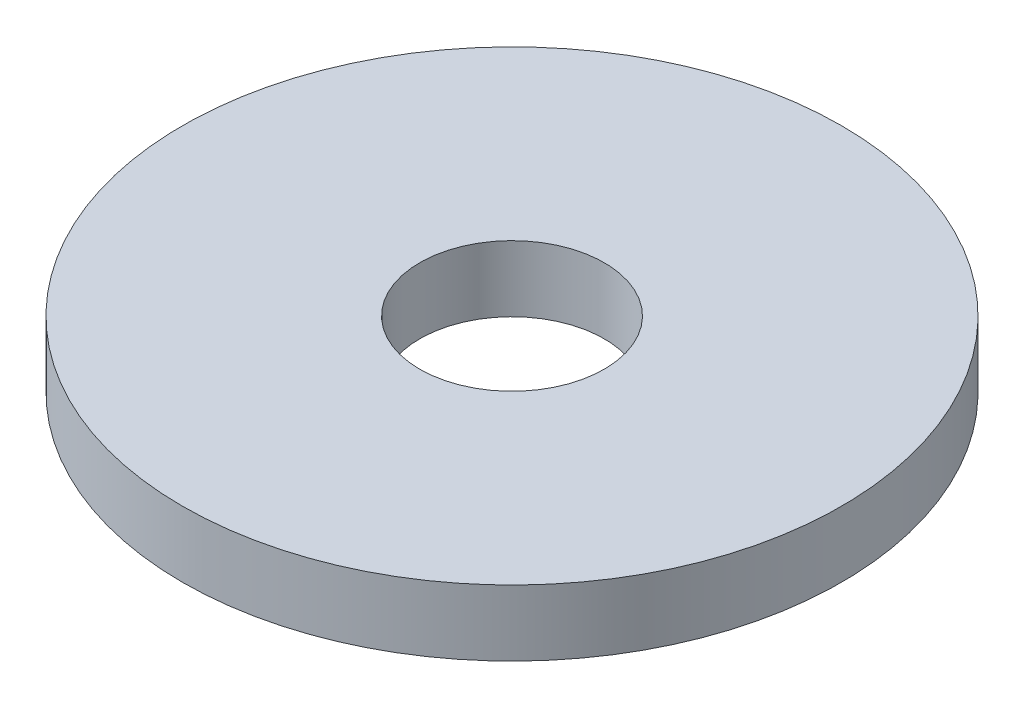
ISO-10303-21;
HEADER;
FILE_DESCRIPTION(('STEP AP214'),'2;1');
FILE_NAME('part.step','',(''),(''),'','','');
FILE_SCHEMA(('AUTOMOTIVE_DESIGN { 1 0 10303 214 1 1 1 1 }'));
ENDSEC;
DATA;
#1=APPLICATION_CONTEXT('core data for automotive mechanical design processes');
#2=APPLICATION_PROTOCOL_DEFINITION('international standard','automotive_design',2000,#1);
#3=PRODUCT_CONTEXT('',#1,'mechanical');
#4=PRODUCT('Part','Part','',(#3));
#5=PRODUCT_RELATED_PRODUCT_CATEGORY('part','',(#4));
#6=PRODUCT_DEFINITION_FORMATION('','',#4);
#7=PRODUCT_DEFINITION_CONTEXT('part definition',#1,'design');
#8=PRODUCT_DEFINITION('design','',#6,#7);
#9=PRODUCT_DEFINITION_SHAPE('','',#8);
#10=(LENGTH_UNIT() NAMED_UNIT(*) SI_UNIT(.MILLI.,.METRE.));
#11=(NAMED_UNIT(*) PLANE_ANGLE_UNIT() SI_UNIT($,.RADIAN.));
#12=(NAMED_UNIT(*) SI_UNIT($,.STERADIAN.) SOLID_ANGLE_UNIT());
#13=UNCERTAINTY_MEASURE_WITH_UNIT(LENGTH_MEASURE(1.E-05),#10,'distance_accuracy_value','');
#14=(GEOMETRIC_REPRESENTATION_CONTEXT(3) GLOBAL_UNCERTAINTY_ASSIGNED_CONTEXT((#13)) GLOBAL_UNIT_ASSIGNED_CONTEXT((#10,
#11,#12)) REPRESENTATION_CONTEXT('',''));
#15=CARTESIAN_POINT('',(0.,0.,0.));
#16=DIRECTION('',(0.,0.,1.));
#17=DIRECTION('',(1.,0.,0.));
#18=AXIS2_PLACEMENT_3D('',#15,#16,#17);
#19=CARTESIAN_POINT('',(0.,5.,0.));
#20=DIRECTION('',(0.,1.,0.));
#21=DIRECTION('',(0.,0.,1.));
#22=AXIS2_PLACEMENT_3D('',#19,#20,#21);
#23=PLANE('',#22);
#24=CARTESIAN_POINT('',(0.,5.,0.));
#25=DIRECTION('',(0.,1.,0.));
#26=DIRECTION('',(0.,0.,1.));
#27=AXIS2_PLACEMENT_3D('',#24,#25,#26);
#28=CIRCLE('',#27,25.);
#29=CARTESIAN_POINT('',(0.,5.,25.));
#30=VERTEX_POINT('',#29);
#31=EDGE_CURVE('E10',#30,#30,#28,.T.);
#32=ORIENTED_EDGE('',*,*,#31,.T.);
#33=EDGE_LOOP('',(#32));
#34=FACE_BOUND('',#33,.T.);
#35=CARTESIAN_POINT('',(0.,5.,0.));
#36=DIRECTION('',(0.,1.,0.));
#37=DIRECTION('',(0.,0.,1.));
#38=AXIS2_PLACEMENT_3D('',#35,#36,#37);
#39=CIRCLE('',#38,7.);
#40=CARTESIAN_POINT('',(0.,5.,7.));
#41=VERTEX_POINT('',#40);
#42=EDGE_CURVE('E49',#41,#41,#39,.T.);
#43=ORIENTED_EDGE('',*,*,#42,.F.);
#44=EDGE_LOOP('',(#43));
#45=FACE_BOUND('',#44,.T.);
#46=ADVANCED_FACE('F39',(#34,#45),#23,.T.);
#47=CARTESIAN_POINT('',(0.,0.,0.));
#48=DIRECTION('',(0.,1.,0.));
#49=DIRECTION('',(0.,0.,1.));
#50=AXIS2_PLACEMENT_3D('',#47,#48,#49);
#51=PLANE('',#50);
#52=CARTESIAN_POINT('',(0.,0.,0.));
#53=DIRECTION('',(0.,1.,0.));
#54=DIRECTION('',(0.,0.,1.));
#55=AXIS2_PLACEMENT_3D('',#52,#53,#54);
#56=CIRCLE('',#55,25.);
#57=CARTESIAN_POINT('',(0.,0.,25.));
#58=VERTEX_POINT('',#57);
#59=EDGE_CURVE('E43',#58,#58,#56,.T.);
#60=ORIENTED_EDGE('',*,*,#59,.F.);
#61=EDGE_LOOP('',(#60));
#62=FACE_BOUND('',#61,.T.);
#63=CARTESIAN_POINT('',(0.,0.,0.));
#64=DIRECTION('',(0.,1.,0.));
#65=DIRECTION('',(0.,0.,1.));
#66=AXIS2_PLACEMENT_3D('',#63,#64,#65);
#67=CIRCLE('',#66,7.);
#68=CARTESIAN_POINT('',(0.,0.,7.));
#69=VERTEX_POINT('',#68);
#70=EDGE_CURVE('E55',#69,#69,#67,.T.);
#71=ORIENTED_EDGE('',*,*,#70,.T.);
#72=EDGE_LOOP('',(#71));
#73=FACE_BOUND('',#72,.T.);
#74=ADVANCED_FACE('F61',(#62,#73),#51,.F.);
#75=CARTESIAN_POINT('',(0.,5.,0.));
#76=DIRECTION('',(0.,-1.,0.));
#77=DIRECTION('',(0.,0.,-1.));
#78=AXIS2_PLACEMENT_3D('',#75,#76,#77);
#79=CYLINDRICAL_SURFACE('',#78,25.);
#80=ORIENTED_EDGE('',*,*,#31,.F.);
#81=EDGE_LOOP('',(#80));
#82=FACE_BOUND('',#81,.T.);
#83=ORIENTED_EDGE('',*,*,#59,.T.);
#84=EDGE_LOOP('',(#83));
#85=FACE_BOUND('',#84,.T.);
#86=ADVANCED_FACE('F41',(#82,#85),#79,.T.);
#87=CARTESIAN_POINT('',(0.,5.,0.));
#88=DIRECTION('',(0.,-1.,0.));
#89=DIRECTION('',(0.,0.,-1.));
#90=AXIS2_PLACEMENT_3D('',#87,#88,#89);
#91=CYLINDRICAL_SURFACE('',#90,7.);
#92=ORIENTED_EDGE('',*,*,#42,.T.);
#93=EDGE_LOOP('',(#92));
#94=FACE_BOUND('',#93,.T.);
#95=ORIENTED_EDGE('',*,*,#70,.F.);
#96=EDGE_LOOP('',(#95));
#97=FACE_BOUND('',#96,.T.);
#98=ADVANCED_FACE('F59',(#94,#97),#91,.F.);
#99=CLOSED_SHELL('',(#46,#74,#86,#98));
#100=MANIFOLD_SOLID_BREP('B2',#99);
#101=ADVANCED_BREP_SHAPE_REPRESENTATION('',(#18,#100),#14);
#102=SHAPE_DEFINITION_REPRESENTATION(#9,#101);
ENDSEC;
END-ISO-10303-21;
